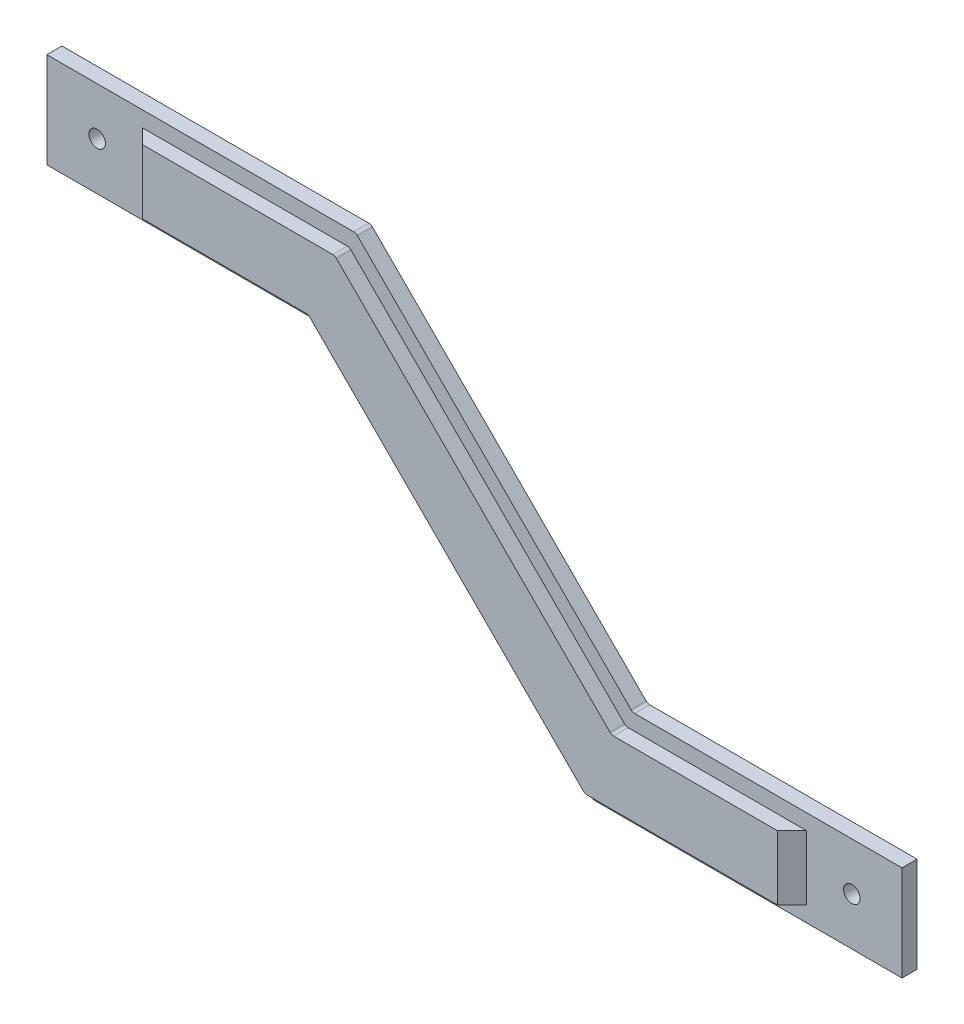
ISO-10303-21;
HEADER;
FILE_DESCRIPTION(('STEP AP214'),'2;1');
FILE_NAME('part.step','',(''),(''),'','','');
FILE_SCHEMA(('AUTOMOTIVE_DESIGN { 1 0 10303 214 1 1 1 1 }'));
ENDSEC;
DATA;
#1=APPLICATION_CONTEXT('core data for automotive mechanical design processes');
#2=APPLICATION_PROTOCOL_DEFINITION('international standard','automotive_design',2000,#1);
#3=PRODUCT_CONTEXT('',#1,'mechanical');
#4=PRODUCT('Part','Part','',(#3));
#5=PRODUCT_RELATED_PRODUCT_CATEGORY('part','',(#4));
#6=PRODUCT_DEFINITION_FORMATION('','',#4);
#7=PRODUCT_DEFINITION_CONTEXT('part definition',#1,'design');
#8=PRODUCT_DEFINITION('design','',#6,#7);
#9=PRODUCT_DEFINITION_SHAPE('','',#8);
#10=(LENGTH_UNIT() NAMED_UNIT(*) SI_UNIT(.MILLI.,.METRE.));
#11=(NAMED_UNIT(*) PLANE_ANGLE_UNIT() SI_UNIT($,.RADIAN.));
#12=(NAMED_UNIT(*) SI_UNIT($,.STERADIAN.) SOLID_ANGLE_UNIT());
#13=UNCERTAINTY_MEASURE_WITH_UNIT(LENGTH_MEASURE(1.E-05),#10,'distance_accuracy_value','');
#14=(GEOMETRIC_REPRESENTATION_CONTEXT(3) GLOBAL_UNCERTAINTY_ASSIGNED_CONTEXT((#13)) GLOBAL_UNIT_ASSIGNED_CONTEXT((#10,
#11,#12)) REPRESENTATION_CONTEXT('',''));
#15=CARTESIAN_POINT('',(0.,0.,0.));
#16=DIRECTION('',(0.,0.,1.));
#17=DIRECTION('',(1.,0.,0.));
#18=AXIS2_PLACEMENT_3D('',#15,#16,#17);
#19=CARTESIAN_POINT('',(0.,0.,3.));
#20=DIRECTION('',(0.,0.,-1.));
#21=DIRECTION('',(-1.,0.,0.));
#22=AXIS2_PLACEMENT_3D('',#19,#20,#21);
#23=PLANE('',#22);
#24=CARTESIAN_POINT('',(75.15,-27.55,3.));
#25=DIRECTION('',(0.,0.,1.));
#26=DIRECTION('',(1.,0.,0.));
#27=AXIS2_PLACEMENT_3D('',#24,#25,#26);
#28=CIRCLE('',#27,1.65);
#29=CARTESIAN_POINT('',(76.8,-27.55,3.));
#30=VERTEX_POINT('',#29);
#31=EDGE_CURVE('E381',#30,#30,#28,.T.);
#32=ORIENTED_EDGE('',*,*,#31,.F.);
#33=EDGE_LOOP('',(#32));
#34=FACE_BOUND('',#33,.T.);
#35=CARTESIAN_POINT('',(-75.15,27.55,3.));
#36=DIRECTION('',(0.,0.,1.));
#37=DIRECTION('',(1.,0.,0.));
#38=AXIS2_PLACEMENT_3D('',#35,#36,#37);
#39=CIRCLE('',#38,1.65);
#40=CARTESIAN_POINT('',(-73.5,27.55,3.));
#41=VERTEX_POINT('',#40);
#42=EDGE_CURVE('E333',#41,#41,#39,.T.);
#43=ORIENTED_EDGE('',*,*,#42,.F.);
#44=EDGE_LOOP('',(#43));
#45=FACE_BOUND('',#44,.T.);
#46=DIRECTION('',(-0.707106781186546,0.707106781186549,0.));
#47=VECTOR('',#46,1.);
#48=CARTESIAN_POINT('',(-23.6149711574555,37.05,3.));
#49=LINE('',#48,#47);
#50=CARTESIAN_POINT('',(31.1921356237317,-17.7571067811874,3.));
#51=VERTEX_POINT('',#50);
#52=CARTESIAN_POINT('',(-23.322077938642,36.7571067811865,3.));
#53=VERTEX_POINT('',#52);
#54=EDGE_CURVE('E370',#51,#53,#49,.T.);
#55=ORIENTED_EDGE('',*,*,#54,.T.);
#56=CARTESIAN_POINT('',(-24.0291847198286,36.05,3.));
#57=DIRECTION('',(0.,0.,-1.));
#58=DIRECTION('',(-1.,0.,0.));
#59=AXIS2_PLACEMENT_3D('',#56,#57,#58);
#60=CIRCLE('',#59,1.);
#61=CARTESIAN_POINT('',(-24.0291847198286,37.05,3.));
#62=VERTEX_POINT('',#61);
#63=EDGE_CURVE('E276',#53,#62,#60,.F.);
#64=ORIENTED_EDGE('',*,*,#63,.T.);
#65=DIRECTION('',(-1.,0.,0.));
#66=VECTOR('',#65,1.);
#67=CARTESIAN_POINT('',(-85.15,37.05,3.));
#68=LINE('',#67,#66);
#69=CARTESIAN_POINT('',(-85.15,37.05,3.));
#70=VERTEX_POINT('',#69);
#71=EDGE_CURVE('E215',#62,#70,#68,.T.);
#72=ORIENTED_EDGE('',*,*,#71,.T.);
#73=DIRECTION('',(0.,-1.,0.));
#74=VECTOR('',#73,1.);
#75=CARTESIAN_POINT('',(-85.15,18.05,3.));
#76=LINE('',#75,#74);
#77=CARTESIAN_POINT('',(-85.15,18.05,3.));
#78=VERTEX_POINT('',#77);
#79=EDGE_CURVE('E210',#70,#78,#76,.T.);
#80=ORIENTED_EDGE('',*,*,#79,.T.);
#81=DIRECTION('',(1.,0.,0.));
#82=VECTOR('',#81,1.);
#83=CARTESIAN_POINT('',(-31.4850288425443,18.05,3.));
#84=LINE('',#83,#82);
#85=CARTESIAN_POINT('',(-31.8992424049174,18.05,3.));
#86=VERTEX_POINT('',#85);
#87=EDGE_CURVE('E198',#78,#86,#84,.T.);
#88=ORIENTED_EDGE('',*,*,#87,.T.);
#89=CARTESIAN_POINT('',(-31.8992424049174,17.05,3.));
#90=DIRECTION('',(0.,0.,-1.));
#91=DIRECTION('',(-1.,0.,0.));
#92=AXIS2_PLACEMENT_3D('',#89,#90,#91);
#93=CIRCLE('',#92,1.);
#94=CARTESIAN_POINT('',(-31.1921356237309,17.7571067811866,3.));
#95=VERTEX_POINT('',#94);
#96=EDGE_CURVE('E46',#86,#95,#93,.T.);
#97=ORIENTED_EDGE('',*,*,#96,.T.);
#98=DIRECTION('',(0.707106781186547,-0.707106781186549,0.));
#99=VECTOR('',#98,1.);
#100=CARTESIAN_POINT('',(23.6149711574555,-37.05,3.));
#101=LINE('',#100,#99);
#102=CARTESIAN_POINT('',(23.3220779386421,-36.7571067811866,3.));
#103=VERTEX_POINT('',#102);
#104=EDGE_CURVE('E209',#95,#103,#101,.T.);
#105=ORIENTED_EDGE('',*,*,#104,.T.);
#106=CARTESIAN_POINT('',(24.0291847198286,-36.05,3.));
#107=DIRECTION('',(0.,0.,-1.));
#108=DIRECTION('',(-1.,0.,0.));
#109=AXIS2_PLACEMENT_3D('',#106,#107,#108);
#110=CIRCLE('',#109,1.);
#111=CARTESIAN_POINT('',(24.0291847198286,-37.05,3.));
#112=VERTEX_POINT('',#111);
#113=EDGE_CURVE('E272',#103,#112,#110,.F.);
#114=ORIENTED_EDGE('',*,*,#113,.T.);
#115=DIRECTION('',(1.,0.,0.));
#116=VECTOR('',#115,1.);
#117=CARTESIAN_POINT('',(85.15,-37.05,3.));
#118=LINE('',#117,#116);
#119=CARTESIAN_POINT('',(85.15,-37.05,3.));
#120=VERTEX_POINT('',#119);
#121=EDGE_CURVE('E321',#112,#120,#118,.T.);
#122=ORIENTED_EDGE('',*,*,#121,.T.);
#123=DIRECTION('',(0.,1.,0.));
#124=VECTOR('',#123,1.);
#125=CARTESIAN_POINT('',(85.15,-18.05,3.));
#126=LINE('',#125,#124);
#127=CARTESIAN_POINT('',(85.15,-18.05,3.));
#128=VERTEX_POINT('',#127);
#129=EDGE_CURVE('E373',#120,#128,#126,.T.);
#130=ORIENTED_EDGE('',*,*,#129,.T.);
#131=DIRECTION('',(-1.,0.,0.));
#132=VECTOR('',#131,1.);
#133=CARTESIAN_POINT('',(31.4850288425451,-18.0500000000008,3.));
#134=LINE('',#133,#132);
#135=CARTESIAN_POINT('',(31.8992424049182,-18.0500000000008,3.));
#136=VERTEX_POINT('',#135);
#137=EDGE_CURVE('E356',#128,#136,#134,.T.);
#138=ORIENTED_EDGE('',*,*,#137,.T.);
#139=CARTESIAN_POINT('',(31.8992424049182,-17.0500000000008,3.));
#140=DIRECTION('',(0.,0.,-1.));
#141=DIRECTION('',(-1.,0.,0.));
#142=AXIS2_PLACEMENT_3D('',#139,#140,#141);
#143=CIRCLE('',#142,1.);
#144=EDGE_CURVE('E305',#136,#51,#143,.T.);
#145=ORIENTED_EDGE('',*,*,#144,.T.);
#146=EDGE_LOOP('',(#55,#64,#72,#80,#88,#97,#105,#114,#122,#130,#138,#145));
#147=FACE_BOUND('',#146,.T.);
#148=DIRECTION('',(-0.707106781186548,0.707106781186548,0.));
#149=VECTOR('',#148,1.);
#150=CARTESIAN_POINT('',(30.2009667991878,-21.15,3.));
#151=LINE('',#150,#149);
#152=CARTESIAN_POINT('',(29.9080735803744,-20.8571067811866,3.));
#153=VERTEX_POINT('',#152);
#154=CARTESIAN_POINT('',(-24.6061399819987,33.6571067811865,3.));
#155=VERTEX_POINT('',#154);
#156=EDGE_CURVE('E390',#153,#155,#151,.T.);
#157=ORIENTED_EDGE('',*,*,#156,.F.);
#158=CARTESIAN_POINT('',(30.6151803615609,-20.15,3.));
#159=DIRECTION('',(0.,0.,-1.));
#160=DIRECTION('',(-1.,0.,0.));
#161=AXIS2_PLACEMENT_3D('',#158,#159,#160);
#162=CIRCLE('',#161,1.);
#163=CARTESIAN_POINT('',(30.6151803615609,-21.15,3.));
#164=VERTEX_POINT('',#163);
#165=EDGE_CURVE('E274',#153,#164,#162,.F.);
#166=ORIENTED_EDGE('',*,*,#165,.T.);
#167=DIRECTION('',(-1.,0.,0.));
#168=VECTOR('',#167,1.);
#169=CARTESIAN_POINT('',(66.15,-21.15,3.));
#170=LINE('',#169,#168);
#171=CARTESIAN_POINT('',(66.15,-21.15,3.));
#172=VERTEX_POINT('',#171);
#173=EDGE_CURVE('E394',#172,#164,#170,.T.);
#174=ORIENTED_EDGE('',*,*,#173,.F.);
#175=DIRECTION('',(0.,1.,0.));
#176=VECTOR('',#175,1.);
#177=CARTESIAN_POINT('',(66.15,-33.95,3.));
#178=LINE('',#177,#176);
#179=CARTESIAN_POINT('',(66.15,-33.95,3.));
#180=VERTEX_POINT('',#179);
#181=EDGE_CURVE('E397',#180,#172,#178,.T.);
#182=ORIENTED_EDGE('',*,*,#181,.F.);
#183=DIRECTION('',(1.,0.,0.));
#184=VECTOR('',#183,1.);
#185=CARTESIAN_POINT('',(24.8990332008122,-33.95,3.));
#186=LINE('',#185,#184);
#187=CARTESIAN_POINT('',(25.3132467631853,-33.95,3.));
#188=VERTEX_POINT('',#187);
#189=EDGE_CURVE('E400',#188,#180,#186,.T.);
#190=ORIENTED_EDGE('',*,*,#189,.F.);
#191=CARTESIAN_POINT('',(25.3132467631853,-32.95,3.));
#192=DIRECTION('',(0.,0.,-1.));
#193=DIRECTION('',(-1.,0.,0.));
#194=AXIS2_PLACEMENT_3D('',#191,#192,#193);
#195=CIRCLE('',#194,1.);
#196=CARTESIAN_POINT('',(24.6061399819988,-33.6571067811866,3.));
#197=VERTEX_POINT('',#196);
#198=EDGE_CURVE('E59',#188,#197,#195,.T.);
#199=ORIENTED_EDGE('',*,*,#198,.T.);
#200=DIRECTION('',(0.707106781186548,-0.707106781186547,0.));
#201=VECTOR('',#200,1.);
#202=CARTESIAN_POINT('',(-30.2009667991878,21.15,3.));
#203=LINE('',#202,#201);
#204=CARTESIAN_POINT('',(-29.9080735803744,20.8571067811865,3.));
#205=VERTEX_POINT('',#204);
#206=EDGE_CURVE('E402',#205,#197,#203,.T.);
#207=ORIENTED_EDGE('',*,*,#206,.F.);
#208=CARTESIAN_POINT('',(-30.6151803615609,20.15,3.));
#209=DIRECTION('',(0.,0.,-1.));
#210=DIRECTION('',(-1.,0.,0.));
#211=AXIS2_PLACEMENT_3D('',#208,#209,#210);
#212=CIRCLE('',#211,1.);
#213=CARTESIAN_POINT('',(-30.6151803615609,21.15,3.));
#214=VERTEX_POINT('',#213);
#215=EDGE_CURVE('E53',#205,#214,#212,.F.);
#216=ORIENTED_EDGE('',*,*,#215,.T.);
#217=DIRECTION('',(1.,0.,0.));
#218=VECTOR('',#217,1.);
#219=CARTESIAN_POINT('',(-66.15,21.15,3.));
#220=LINE('',#219,#218);
#221=CARTESIAN_POINT('',(-66.15,21.15,3.));
#222=VERTEX_POINT('',#221);
#223=EDGE_CURVE('E404',#222,#214,#220,.T.);
#224=ORIENTED_EDGE('',*,*,#223,.F.);
#225=DIRECTION('',(0.,-1.,0.));
#226=VECTOR('',#225,1.);
#227=CARTESIAN_POINT('',(-66.15,33.95,3.));
#228=LINE('',#227,#226);
#229=CARTESIAN_POINT('',(-66.15,33.95,3.));
#230=VERTEX_POINT('',#229);
#231=EDGE_CURVE('E406',#230,#222,#228,.T.);
#232=ORIENTED_EDGE('',*,*,#231,.F.);
#233=DIRECTION('',(-1.,0.,0.));
#234=VECTOR('',#233,1.);
#235=CARTESIAN_POINT('',(-24.8990332008122,33.95,3.));
#236=LINE('',#235,#234);
#237=CARTESIAN_POINT('',(-25.3132467631853,33.95,3.));
#238=VERTEX_POINT('',#237);
#239=EDGE_CURVE('E409',#238,#230,#236,.T.);
#240=ORIENTED_EDGE('',*,*,#239,.F.);
#241=CARTESIAN_POINT('',(-25.3132467631853,32.95,3.));
#242=DIRECTION('',(0.,0.,-1.));
#243=DIRECTION('',(-1.,0.,0.));
#244=AXIS2_PLACEMENT_3D('',#241,#242,#243);
#245=CIRCLE('',#244,1.);
#246=EDGE_CURVE('E301',#238,#155,#245,.T.);
#247=ORIENTED_EDGE('',*,*,#246,.T.);
#248=EDGE_LOOP('',(#157,#166,#174,#182,#190,#199,#207,#216,#224,#232,#240,#247));
#249=FACE_BOUND('',#248,.T.);
#250=ADVANCED_FACE('F38',(#34,#45,#147,#249),#23,.F.);
#251=CARTESIAN_POINT('',(0.,0.,0.));
#252=DIRECTION('',(0.,0.,-1.));
#253=DIRECTION('',(-1.,0.,0.));
#254=AXIS2_PLACEMENT_3D('',#251,#252,#253);
#255=PLANE('',#254);
#256=CARTESIAN_POINT('',(-75.15,27.55,0.));
#257=DIRECTION('',(0.,0.,1.));
#258=DIRECTION('',(1.,0.,0.));
#259=AXIS2_PLACEMENT_3D('',#256,#257,#258);
#260=CIRCLE('',#259,1.65);
#261=CARTESIAN_POINT('',(-73.5,27.55,0.));
#262=VERTEX_POINT('',#261);
#263=EDGE_CURVE('E378',#262,#262,#260,.T.);
#264=ORIENTED_EDGE('',*,*,#263,.T.);
#265=EDGE_LOOP('',(#264));
#266=FACE_BOUND('',#265,.T.);
#267=DIRECTION('',(-1.,0.,0.));
#268=VECTOR('',#267,1.);
#269=CARTESIAN_POINT('',(-85.15,37.05,0.));
#270=LINE('',#269,#268);
#271=CARTESIAN_POINT('',(-24.0291847198286,37.05,0.));
#272=VERTEX_POINT('',#271);
#273=CARTESIAN_POINT('',(-85.15,37.05,0.));
#274=VERTEX_POINT('',#273);
#275=EDGE_CURVE('E219',#272,#274,#270,.T.);
#276=ORIENTED_EDGE('',*,*,#275,.F.);
#277=CARTESIAN_POINT('',(-24.0291847198286,36.05,0.));
#278=DIRECTION('',(0.,0.,-1.));
#279=DIRECTION('',(-1.,0.,0.));
#280=AXIS2_PLACEMENT_3D('',#277,#278,#279);
#281=CIRCLE('',#280,1.);
#282=CARTESIAN_POINT('',(-23.322077938642,36.7571067811865,0.));
#283=VERTEX_POINT('',#282);
#284=EDGE_CURVE('E264',#272,#283,#281,.T.);
#285=ORIENTED_EDGE('',*,*,#284,.T.);
#286=DIRECTION('',(-0.707106781186546,0.707106781186549,0.));
#287=VECTOR('',#286,1.);
#288=CARTESIAN_POINT('',(-23.6149711574555,37.05,0.));
#289=LINE('',#288,#287);
#290=CARTESIAN_POINT('',(31.1921356237317,-17.7571067811874,0.));
#291=VERTEX_POINT('',#290);
#292=EDGE_CURVE('E343',#291,#283,#289,.T.);
#293=ORIENTED_EDGE('',*,*,#292,.F.);
#294=CARTESIAN_POINT('',(31.8992424049182,-17.0500000000008,0.));
#295=DIRECTION('',(0.,0.,-1.));
#296=DIRECTION('',(-1.,0.,0.));
#297=AXIS2_PLACEMENT_3D('',#294,#295,#296);
#298=CIRCLE('',#297,1.);
#299=CARTESIAN_POINT('',(31.8992424049182,-18.0500000000008,0.));
#300=VERTEX_POINT('',#299);
#301=EDGE_CURVE('E303',#291,#300,#298,.F.);
#302=ORIENTED_EDGE('',*,*,#301,.T.);
#303=DIRECTION('',(-1.,0.,0.));
#304=VECTOR('',#303,1.);
#305=CARTESIAN_POINT('',(31.4850288425451,-18.0500000000008,0.));
#306=LINE('',#305,#304);
#307=CARTESIAN_POINT('',(85.15,-18.05,0.));
#308=VERTEX_POINT('',#307);
#309=EDGE_CURVE('E340',#308,#300,#306,.T.);
#310=ORIENTED_EDGE('',*,*,#309,.F.);
#311=DIRECTION('',(0.,1.,0.));
#312=VECTOR('',#311,1.);
#313=CARTESIAN_POINT('',(85.15,-18.05,0.));
#314=LINE('',#313,#312);
#315=CARTESIAN_POINT('',(85.15,-37.05,0.));
#316=VERTEX_POINT('',#315);
#317=EDGE_CURVE('E338',#316,#308,#314,.T.);
#318=ORIENTED_EDGE('',*,*,#317,.F.);
#319=DIRECTION('',(1.,0.,0.));
#320=VECTOR('',#319,1.);
#321=CARTESIAN_POINT('',(85.15,-37.05,0.));
#322=LINE('',#321,#320);
#323=CARTESIAN_POINT('',(24.0291847198286,-37.05,0.));
#324=VERTEX_POINT('',#323);
#325=EDGE_CURVE('E331',#324,#316,#322,.T.);
#326=ORIENTED_EDGE('',*,*,#325,.F.);
#327=CARTESIAN_POINT('',(24.0291847198286,-36.05,0.));
#328=DIRECTION('',(0.,0.,-1.));
#329=DIRECTION('',(-1.,0.,0.));
#330=AXIS2_PLACEMENT_3D('',#327,#328,#329);
#331=CIRCLE('',#330,1.);
#332=CARTESIAN_POINT('',(23.3220779386421,-36.7571067811866,0.));
#333=VERTEX_POINT('',#332);
#334=EDGE_CURVE('E262',#324,#333,#331,.T.);
#335=ORIENTED_EDGE('',*,*,#334,.T.);
#336=DIRECTION('',(0.707106781186547,-0.707106781186549,0.));
#337=VECTOR('',#336,1.);
#338=CARTESIAN_POINT('',(23.6149711574555,-37.05,0.));
#339=LINE('',#338,#337);
#340=CARTESIAN_POINT('',(-31.1921356237309,17.7571067811866,0.));
#341=VERTEX_POINT('',#340);
#342=EDGE_CURVE('E329',#341,#333,#339,.T.);
#343=ORIENTED_EDGE('',*,*,#342,.F.);
#344=CARTESIAN_POINT('',(-31.8992424049174,17.05,0.));
#345=DIRECTION('',(0.,0.,-1.));
#346=DIRECTION('',(-1.,0.,0.));
#347=AXIS2_PLACEMENT_3D('',#344,#345,#346);
#348=CIRCLE('',#347,1.);
#349=CARTESIAN_POINT('',(-31.8992424049174,18.05,0.));
#350=VERTEX_POINT('',#349);
#351=EDGE_CURVE('E310',#341,#350,#348,.F.);
#352=ORIENTED_EDGE('',*,*,#351,.T.);
#353=DIRECTION('',(1.,0.,0.));
#354=VECTOR('',#353,1.);
#355=CARTESIAN_POINT('',(-31.4850288425443,18.05,0.));
#356=LINE('',#355,#354);
#357=CARTESIAN_POINT('',(-85.15,18.05,0.));
#358=VERTEX_POINT('',#357);
#359=EDGE_CURVE('E328',#358,#350,#356,.T.);
#360=ORIENTED_EDGE('',*,*,#359,.F.);
#361=DIRECTION('',(0.,-1.,0.));
#362=VECTOR('',#361,1.);
#363=CARTESIAN_POINT('',(-85.15,18.05,0.));
#364=LINE('',#363,#362);
#365=EDGE_CURVE('E223',#274,#358,#364,.T.);
#366=ORIENTED_EDGE('',*,*,#365,.F.);
#367=EDGE_LOOP('',(#276,#285,#293,#302,#310,#318,#326,#335,#343,#352,#360,#366));
#368=FACE_BOUND('',#367,.T.);
#369=CARTESIAN_POINT('',(75.15,-27.55,0.));
#370=DIRECTION('',(0.,0.,1.));
#371=DIRECTION('',(1.,0.,0.));
#372=AXIS2_PLACEMENT_3D('',#369,#370,#371);
#373=CIRCLE('',#372,1.65);
#374=CARTESIAN_POINT('',(76.8,-27.55,0.));
#375=VERTEX_POINT('',#374);
#376=EDGE_CURVE('E384',#375,#375,#373,.T.);
#377=ORIENTED_EDGE('',*,*,#376,.T.);
#378=EDGE_LOOP('',(#377));
#379=FACE_BOUND('',#378,.T.);
#380=ADVANCED_FACE('F326',(#266,#368,#379),#255,.T.);
#381=CARTESIAN_POINT('',(-85.15,18.05,3.));
#382=DIRECTION('',(1.,0.,0.));
#383=DIRECTION('',(0.,0.,-1.));
#384=AXIS2_PLACEMENT_3D('',#381,#382,#383);
#385=PLANE('',#384);
#386=ORIENTED_EDGE('',*,*,#365,.T.);
#387=DIRECTION('',(0.,0.,-1.));
#388=VECTOR('',#387,1.);
#389=CARTESIAN_POINT('',(-85.15,18.05,3.));
#390=LINE('',#389,#388);
#391=EDGE_CURVE('E203',#78,#358,#390,.T.);
#392=ORIENTED_EDGE('',*,*,#391,.F.);
#393=ORIENTED_EDGE('',*,*,#79,.F.);
#394=DIRECTION('',(0.,0.,-1.));
#395=VECTOR('',#394,1.);
#396=CARTESIAN_POINT('',(-85.15,37.05,3.));
#397=LINE('',#396,#395);
#398=EDGE_CURVE('E347',#70,#274,#397,.T.);
#399=ORIENTED_EDGE('',*,*,#398,.T.);
#400=EDGE_LOOP('',(#386,#392,#393,#399));
#401=FACE_BOUND('',#400,.T.);
#402=ADVANCED_FACE('F221',(#401),#385,.F.);
#403=CARTESIAN_POINT('',(-31.4850288425443,18.05,3.));
#404=DIRECTION('',(0.,1.,0.));
#405=DIRECTION('',(-1.,0.,0.));
#406=AXIS2_PLACEMENT_3D('',#403,#404,#405);
#407=PLANE('',#406);
#408=ORIENTED_EDGE('',*,*,#359,.T.);
#409=DIRECTION('',(0.,0.,-1.));
#410=VECTOR('',#409,1.);
#411=CARTESIAN_POINT('',(-31.8992424049174,18.05,3.));
#412=LINE('',#411,#410);
#413=EDGE_CURVE('E206',#350,#86,#412,.F.);
#414=ORIENTED_EDGE('',*,*,#413,.T.);
#415=ORIENTED_EDGE('',*,*,#87,.F.);
#416=ORIENTED_EDGE('',*,*,#391,.T.);
#417=EDGE_LOOP('',(#408,#414,#415,#416));
#418=FACE_BOUND('',#417,.T.);
#419=ADVANCED_FACE('F201',(#418),#407,.F.);
#420=CARTESIAN_POINT('',(23.6149711574555,-37.05,3.));
#421=DIRECTION('',(0.707106781186548,0.707106781186546,0.));
#422=DIRECTION('',(-0.707106781186547,0.707106781186549,0.));
#423=AXIS2_PLACEMENT_3D('',#420,#421,#422);
#424=PLANE('',#423);
#425=ORIENTED_EDGE('',*,*,#342,.T.);
#426=DIRECTION('',(0.,0.,-1.));
#427=VECTOR('',#426,1.);
#428=CARTESIAN_POINT('',(23.3220779386421,-36.7571067811866,3.));
#429=LINE('',#428,#427);
#430=EDGE_CURVE('E288',#333,#103,#429,.F.);
#431=ORIENTED_EDGE('',*,*,#430,.T.);
#432=ORIENTED_EDGE('',*,*,#104,.F.);
#433=DIRECTION('',(0.,0.,-1.));
#434=VECTOR('',#433,1.);
#435=CARTESIAN_POINT('',(-31.1921356237309,17.7571067811866,0.));
#436=LINE('',#435,#434);
#437=EDGE_CURVE('E285',#95,#341,#436,.T.);
#438=ORIENTED_EDGE('',*,*,#437,.T.);
#439=EDGE_LOOP('',(#425,#431,#432,#438));
#440=FACE_BOUND('',#439,.T.);
#441=ADVANCED_FACE('F318',(#440),#424,.F.);
#442=CARTESIAN_POINT('',(85.15,-37.05,3.));
#443=DIRECTION('',(0.,1.,0.));
#444=DIRECTION('',(-1.,0.,0.));
#445=AXIS2_PLACEMENT_3D('',#442,#443,#444);
#446=PLANE('',#445);
#447=ORIENTED_EDGE('',*,*,#121,.F.);
#448=DIRECTION('',(0.,0.,-1.));
#449=VECTOR('',#448,1.);
#450=CARTESIAN_POINT('',(24.0291847198286,-37.05,3.));
#451=LINE('',#450,#449);
#452=EDGE_CURVE('E282',#112,#324,#451,.T.);
#453=ORIENTED_EDGE('',*,*,#452,.T.);
#454=ORIENTED_EDGE('',*,*,#325,.T.);
#455=DIRECTION('',(0.,0.,-1.));
#456=VECTOR('',#455,1.);
#457=CARTESIAN_POINT('',(85.15,-37.05,3.));
#458=LINE('',#457,#456);
#459=EDGE_CURVE('E225',#120,#316,#458,.T.);
#460=ORIENTED_EDGE('',*,*,#459,.F.);
#461=EDGE_LOOP('',(#447,#453,#454,#460));
#462=FACE_BOUND('',#461,.T.);
#463=ADVANCED_FACE('F485',(#462),#446,.F.);
#464=CARTESIAN_POINT('',(85.15,-18.05,3.));
#465=DIRECTION('',(-1.,0.,0.));
#466=DIRECTION('',(0.,0.,1.));
#467=AXIS2_PLACEMENT_3D('',#464,#465,#466);
#468=PLANE('',#467);
#469=ORIENTED_EDGE('',*,*,#317,.T.);
#470=DIRECTION('',(0.,0.,-1.));
#471=VECTOR('',#470,1.);
#472=CARTESIAN_POINT('',(85.15,-18.05,3.));
#473=LINE('',#472,#471);
#474=EDGE_CURVE('E231',#128,#308,#473,.T.);
#475=ORIENTED_EDGE('',*,*,#474,.F.);
#476=ORIENTED_EDGE('',*,*,#129,.F.);
#477=ORIENTED_EDGE('',*,*,#459,.T.);
#478=EDGE_LOOP('',(#469,#475,#476,#477));
#479=FACE_BOUND('',#478,.T.);
#480=ADVANCED_FACE('F482',(#479),#468,.F.);
#481=CARTESIAN_POINT('',(31.4850288425451,-18.0500000000008,3.));
#482=DIRECTION('',(0.,-1.,0.));
#483=DIRECTION('',(1.,0.,0.));
#484=AXIS2_PLACEMENT_3D('',#481,#482,#483);
#485=PLANE('',#484);
#486=ORIENTED_EDGE('',*,*,#309,.T.);
#487=DIRECTION('',(0.,0.,-1.));
#488=VECTOR('',#487,1.);
#489=CARTESIAN_POINT('',(31.8992424049182,-18.0500000000008,3.));
#490=LINE('',#489,#488);
#491=EDGE_CURVE('E278',#300,#136,#490,.F.);
#492=ORIENTED_EDGE('',*,*,#491,.T.);
#493=ORIENTED_EDGE('',*,*,#137,.F.);
#494=ORIENTED_EDGE('',*,*,#474,.T.);
#495=EDGE_LOOP('',(#486,#492,#493,#494));
#496=FACE_BOUND('',#495,.T.);
#497=ADVANCED_FACE('F353',(#496),#485,.F.);
#498=CARTESIAN_POINT('',(-23.6149711574555,37.05,3.));
#499=DIRECTION('',(-0.707106781186549,-0.707106781186546,0.));
#500=DIRECTION('',(0.707106781186546,-0.707106781186549,0.));
#501=AXIS2_PLACEMENT_3D('',#498,#499,#500);
#502=PLANE('',#501);
#503=ORIENTED_EDGE('',*,*,#292,.T.);
#504=DIRECTION('',(0.,0.,-1.));
#505=VECTOR('',#504,1.);
#506=CARTESIAN_POINT('',(-23.322077938642,36.7571067811865,3.));
#507=LINE('',#506,#505);
#508=EDGE_CURVE('E269',#283,#53,#507,.F.);
#509=ORIENTED_EDGE('',*,*,#508,.T.);
#510=ORIENTED_EDGE('',*,*,#54,.F.);
#511=DIRECTION('',(0.,0.,-1.));
#512=VECTOR('',#511,1.);
#513=CARTESIAN_POINT('',(31.1921356237317,-17.7571067811874,0.));
#514=LINE('',#513,#512);
#515=EDGE_CURVE('E266',#51,#291,#514,.T.);
#516=ORIENTED_EDGE('',*,*,#515,.T.);
#517=EDGE_LOOP('',(#503,#509,#510,#516));
#518=FACE_BOUND('',#517,.T.);
#519=ADVANCED_FACE('F368',(#518),#502,.F.);
#520=CARTESIAN_POINT('',(-85.15,37.05,3.));
#521=DIRECTION('',(0.,-1.,0.));
#522=DIRECTION('',(0.,0.,-1.));
#523=AXIS2_PLACEMENT_3D('',#520,#521,#522);
#524=PLANE('',#523);
#525=ORIENTED_EDGE('',*,*,#71,.F.);
#526=DIRECTION('',(0.,0.,-1.));
#527=VECTOR('',#526,1.);
#528=CARTESIAN_POINT('',(-24.0291847198286,37.05,3.));
#529=LINE('',#528,#527);
#530=EDGE_CURVE('E259',#62,#272,#529,.T.);
#531=ORIENTED_EDGE('',*,*,#530,.T.);
#532=ORIENTED_EDGE('',*,*,#275,.T.);
#533=ORIENTED_EDGE('',*,*,#398,.F.);
#534=EDGE_LOOP('',(#525,#531,#532,#533));
#535=FACE_BOUND('',#534,.T.);
#536=ADVANCED_FACE('F474',(#535),#524,.F.);
#537=CARTESIAN_POINT('',(-75.15,27.55,3.));
#538=DIRECTION('',(0.,0.,-1.));
#539=DIRECTION('',(-1.,0.,0.));
#540=AXIS2_PLACEMENT_3D('',#537,#538,#539);
#541=CYLINDRICAL_SURFACE('',#540,1.65);
#542=ORIENTED_EDGE('',*,*,#42,.T.);
#543=EDGE_LOOP('',(#542));
#544=FACE_BOUND('',#543,.T.);
#545=ORIENTED_EDGE('',*,*,#263,.F.);
#546=EDGE_LOOP('',(#545));
#547=FACE_BOUND('',#546,.T.);
#548=ADVANCED_FACE('F471',(#544,#547),#541,.F.);
#549=CARTESIAN_POINT('',(75.15,-27.55,3.));
#550=DIRECTION('',(0.,0.,-1.));
#551=DIRECTION('',(-1.,0.,0.));
#552=AXIS2_PLACEMENT_3D('',#549,#550,#551);
#553=CYLINDRICAL_SURFACE('',#552,1.65);
#554=ORIENTED_EDGE('',*,*,#31,.T.);
#555=EDGE_LOOP('',(#554));
#556=FACE_BOUND('',#555,.T.);
#557=ORIENTED_EDGE('',*,*,#376,.F.);
#558=EDGE_LOOP('',(#557));
#559=FACE_BOUND('',#558,.T.);
#560=ADVANCED_FACE('F646',(#556,#559),#553,.F.);
#561=CARTESIAN_POINT('',(-24.8990332008122,33.95,5.9));
#562=DIRECTION('',(0.,-1.,0.));
#563=DIRECTION('',(1.,0.,0.));
#564=AXIS2_PLACEMENT_3D('',#561,#562,#563);
#565=PLANE('',#564);
#566=DIRECTION('',(-1.,0.,0.));
#567=VECTOR('',#566,1.);
#568=CARTESIAN_POINT('',(-24.8990332008122,33.95,5.9));
#569=LINE('',#568,#567);
#570=CARTESIAN_POINT('',(-25.3132467631853,33.95,5.9));
#571=VERTEX_POINT('',#570);
#572=CARTESIAN_POINT('',(-63.25,33.95,5.9));
#573=VERTEX_POINT('',#572);
#574=EDGE_CURVE('E393',#571,#573,#569,.T.);
#575=ORIENTED_EDGE('',*,*,#574,.F.);
#576=DIRECTION('',(0.,0.,-1.));
#577=VECTOR('',#576,1.);
#578=CARTESIAN_POINT('',(-25.3132467631853,33.95,5.9));
#579=LINE('',#578,#577);
#580=EDGE_CURVE('E247',#571,#238,#579,.T.);
#581=ORIENTED_EDGE('',*,*,#580,.T.);
#582=ORIENTED_EDGE('',*,*,#239,.T.);
#583=DIRECTION('',(0.707106781186544,0.,0.707106781186551));
#584=VECTOR('',#583,1.);
#585=CARTESIAN_POINT('',(-63.25,33.95,5.9));
#586=LINE('',#585,#584);
#587=EDGE_CURVE('E244',#230,#573,#586,.T.);
#588=ORIENTED_EDGE('',*,*,#587,.T.);
#589=EDGE_LOOP('',(#575,#581,#582,#588));
#590=FACE_BOUND('',#589,.T.);
#591=ADVANCED_FACE('F433',(#590),#565,.F.);
#592=CARTESIAN_POINT('',(-66.15,21.15,5.9));
#593=DIRECTION('',(0.,1.,0.));
#594=DIRECTION('',(-1.,0.,0.));
#595=AXIS2_PLACEMENT_3D('',#592,#593,#594);
#596=PLANE('',#595);
#597=ORIENTED_EDGE('',*,*,#223,.T.);
#598=DIRECTION('',(0.,0.,-1.));
#599=VECTOR('',#598,1.);
#600=CARTESIAN_POINT('',(-30.6151803615609,21.15,5.9));
#601=LINE('',#600,#599);
#602=CARTESIAN_POINT('',(-30.6151803615609,21.15,5.9));
#603=VERTEX_POINT('',#602);
#604=EDGE_CURVE('E299',#214,#603,#601,.F.);
#605=ORIENTED_EDGE('',*,*,#604,.T.);
#606=DIRECTION('',(1.,0.,0.));
#607=VECTOR('',#606,1.);
#608=CARTESIAN_POINT('',(-66.15,21.15,5.9));
#609=LINE('',#608,#607);
#610=CARTESIAN_POINT('',(-63.25,21.15,5.9));
#611=VERTEX_POINT('',#610);
#612=EDGE_CURVE('E421',#611,#603,#609,.T.);
#613=ORIENTED_EDGE('',*,*,#612,.F.);
#614=DIRECTION('',(-0.707106781186544,0.,-0.707106781186551));
#615=VECTOR('',#614,1.);
#616=CARTESIAN_POINT('',(-63.25,21.15,5.9));
#617=LINE('',#616,#615);
#618=EDGE_CURVE('E242',#611,#222,#617,.T.);
#619=ORIENTED_EDGE('',*,*,#618,.T.);
#620=EDGE_LOOP('',(#597,#605,#613,#619));
#621=FACE_BOUND('',#620,.T.);
#622=ADVANCED_FACE('F439',(#621),#596,.F.);
#623=CARTESIAN_POINT('',(-30.2009667991878,21.15,5.9));
#624=DIRECTION('',(0.707106781186547,0.707106781186548,0.));
#625=DIRECTION('',(-0.707106781186548,0.707106781186547,0.));
#626=AXIS2_PLACEMENT_3D('',#623,#624,#625);
#627=PLANE('',#626);
#628=ORIENTED_EDGE('',*,*,#206,.T.);
#629=DIRECTION('',(0.,0.,-1.));
#630=VECTOR('',#629,1.);
#631=CARTESIAN_POINT('',(24.6061399819988,-33.6571067811866,5.9));
#632=LINE('',#631,#630);
#633=CARTESIAN_POINT('',(24.6061399819988,-33.6571067811866,5.9));
#634=VERTEX_POINT('',#633);
#635=EDGE_CURVE('E296',#197,#634,#632,.F.);
#636=ORIENTED_EDGE('',*,*,#635,.T.);
#637=DIRECTION('',(0.707106781186548,-0.707106781186547,0.));
#638=VECTOR('',#637,1.);
#639=CARTESIAN_POINT('',(-30.2009667991878,21.15,5.9));
#640=LINE('',#639,#638);
#641=CARTESIAN_POINT('',(-29.9080735803744,20.8571067811865,5.9));
#642=VERTEX_POINT('',#641);
#643=EDGE_CURVE('E418',#642,#634,#640,.T.);
#644=ORIENTED_EDGE('',*,*,#643,.F.);
#645=DIRECTION('',(0.,0.,-1.));
#646=VECTOR('',#645,1.);
#647=CARTESIAN_POINT('',(-29.9080735803744,20.8571067811865,3.));
#648=LINE('',#647,#646);
#649=EDGE_CURVE('E293',#642,#205,#648,.T.);
#650=ORIENTED_EDGE('',*,*,#649,.T.);
#651=EDGE_LOOP('',(#628,#636,#644,#650));
#652=FACE_BOUND('',#651,.T.);
#653=ADVANCED_FACE('F528',(#652),#627,.F.);
#654=CARTESIAN_POINT('',(24.8990332008122,-33.95,5.9));
#655=DIRECTION('',(0.,1.,0.));
#656=DIRECTION('',(0.,0.,1.));
#657=AXIS2_PLACEMENT_3D('',#654,#655,#656);
#658=PLANE('',#657);
#659=DIRECTION('',(1.,0.,0.));
#660=VECTOR('',#659,1.);
#661=CARTESIAN_POINT('',(24.8990332008122,-33.95,5.9));
#662=LINE('',#661,#660);
#663=CARTESIAN_POINT('',(25.3132467631853,-33.95,5.9));
#664=VERTEX_POINT('',#663);
#665=CARTESIAN_POINT('',(63.25,-33.95,5.9));
#666=VERTEX_POINT('',#665);
#667=EDGE_CURVE('E416',#664,#666,#662,.T.);
#668=ORIENTED_EDGE('',*,*,#667,.F.);
#669=DIRECTION('',(0.,0.,-1.));
#670=VECTOR('',#669,1.);
#671=CARTESIAN_POINT('',(25.3132467631853,-33.95,5.9));
#672=LINE('',#671,#670);
#673=EDGE_CURVE('E290',#664,#188,#672,.T.);
#674=ORIENTED_EDGE('',*,*,#673,.T.);
#675=ORIENTED_EDGE('',*,*,#189,.T.);
#676=DIRECTION('',(-0.707106781186544,0.,0.707106781186551));
#677=VECTOR('',#676,1.);
#678=CARTESIAN_POINT('',(63.2500000000001,-33.95,5.9));
#679=LINE('',#678,#677);
#680=EDGE_CURVE('E239',#180,#666,#679,.T.);
#681=ORIENTED_EDGE('',*,*,#680,.T.);
#682=EDGE_LOOP('',(#668,#674,#675,#681));
#683=FACE_BOUND('',#682,.T.);
#684=ADVANCED_FACE('F512',(#683),#658,.F.);
#685=CARTESIAN_POINT('',(66.15,-21.15,5.9));
#686=DIRECTION('',(0.,-1.,0.));
#687=DIRECTION('',(0.,0.,-1.));
#688=AXIS2_PLACEMENT_3D('',#685,#686,#687);
#689=PLANE('',#688);
#690=ORIENTED_EDGE('',*,*,#173,.T.);
#691=DIRECTION('',(0.,0.,-1.));
#692=VECTOR('',#691,1.);
#693=CARTESIAN_POINT('',(30.6151803615609,-21.15,5.9));
#694=LINE('',#693,#692);
#695=CARTESIAN_POINT('',(30.6151803615609,-21.15,5.9));
#696=VERTEX_POINT('',#695);
#697=EDGE_CURVE('E280',#164,#696,#694,.F.);
#698=ORIENTED_EDGE('',*,*,#697,.T.);
#699=DIRECTION('',(-1.,0.,0.));
#700=VECTOR('',#699,1.);
#701=CARTESIAN_POINT('',(66.15,-21.15,5.9));
#702=LINE('',#701,#700);
#703=CARTESIAN_POINT('',(63.2500000000001,-21.15,5.9));
#704=VERTEX_POINT('',#703);
#705=EDGE_CURVE('E413',#704,#696,#702,.T.);
#706=ORIENTED_EDGE('',*,*,#705,.F.);
#707=DIRECTION('',(0.707106781186544,0.,-0.707106781186551));
#708=VECTOR('',#707,1.);
#709=CARTESIAN_POINT('',(63.2500000000001,-21.15,5.9));
#710=LINE('',#709,#708);
#711=EDGE_CURVE('E237',#704,#172,#710,.T.);
#712=ORIENTED_EDGE('',*,*,#711,.T.);
#713=EDGE_LOOP('',(#690,#698,#706,#712));
#714=FACE_BOUND('',#713,.T.);
#715=ADVANCED_FACE('F517',(#714),#689,.F.);
#716=CARTESIAN_POINT('',(30.2009667991878,-21.15,5.9));
#717=DIRECTION('',(-0.707106781186547,-0.707106781186547,0.));
#718=DIRECTION('',(0.707106781186548,-0.707106781186548,0.));
#719=AXIS2_PLACEMENT_3D('',#716,#717,#718);
#720=PLANE('',#719);
#721=ORIENTED_EDGE('',*,*,#156,.T.);
#722=DIRECTION('',(0.,0.,-1.));
#723=VECTOR('',#722,1.);
#724=CARTESIAN_POINT('',(-24.6061399819987,33.6571067811865,5.9));
#725=LINE('',#724,#723);
#726=CARTESIAN_POINT('',(-24.6061399819987,33.6571067811865,5.9));
#727=VERTEX_POINT('',#726);
#728=EDGE_CURVE('E253',#155,#727,#725,.F.);
#729=ORIENTED_EDGE('',*,*,#728,.T.);
#730=DIRECTION('',(-0.707106781186548,0.707106781186548,0.));
#731=VECTOR('',#730,1.);
#732=CARTESIAN_POINT('',(30.2009667991878,-21.15,5.9));
#733=LINE('',#732,#731);
#734=CARTESIAN_POINT('',(29.9080735803744,-20.8571067811866,5.9));
#735=VERTEX_POINT('',#734);
#736=EDGE_CURVE('E387',#735,#727,#733,.T.);
#737=ORIENTED_EDGE('',*,*,#736,.F.);
#738=DIRECTION('',(0.,0.,-1.));
#739=VECTOR('',#738,1.);
#740=CARTESIAN_POINT('',(29.9080735803744,-20.8571067811866,3.));
#741=LINE('',#740,#739);
#742=EDGE_CURVE('E250',#735,#153,#741,.T.);
#743=ORIENTED_EDGE('',*,*,#742,.T.);
#744=EDGE_LOOP('',(#721,#729,#737,#743));
#745=FACE_BOUND('',#744,.T.);
#746=ADVANCED_FACE('F445',(#745),#720,.F.);
#747=CARTESIAN_POINT('',(0.,0.,5.9));
#748=DIRECTION('',(0.,0.,1.));
#749=DIRECTION('',(1.,0.,0.));
#750=AXIS2_PLACEMENT_3D('',#747,#748,#749);
#751=PLANE('',#750);
#752=ORIENTED_EDGE('',*,*,#736,.T.);
#753=CARTESIAN_POINT('',(-25.3132467631853,32.95,5.9));
#754=DIRECTION('',(0.,0.,1.));
#755=DIRECTION('',(1.,0.,0.));
#756=AXIS2_PLACEMENT_3D('',#753,#754,#755);
#757=CIRCLE('',#756,1.);
#758=EDGE_CURVE('E257',#727,#571,#757,.T.);
#759=ORIENTED_EDGE('',*,*,#758,.T.);
#760=ORIENTED_EDGE('',*,*,#574,.T.);
#761=DIRECTION('',(0.,-1.,0.));
#762=VECTOR('',#761,1.);
#763=CARTESIAN_POINT('',(-63.25,21.15,5.9));
#764=LINE('',#763,#762);
#765=EDGE_CURVE('E224',#573,#611,#764,.T.);
#766=ORIENTED_EDGE('',*,*,#765,.T.);
#767=ORIENTED_EDGE('',*,*,#612,.T.);
#768=CARTESIAN_POINT('',(-30.6151803615609,20.15,5.9));
#769=DIRECTION('',(0.,0.,1.));
#770=DIRECTION('',(1.,0.,0.));
#771=AXIS2_PLACEMENT_3D('',#768,#769,#770);
#772=CIRCLE('',#771,1.);
#773=EDGE_CURVE('E11',#603,#642,#772,.F.);
#774=ORIENTED_EDGE('',*,*,#773,.T.);
#775=ORIENTED_EDGE('',*,*,#643,.T.);
#776=CARTESIAN_POINT('',(25.3132467631853,-32.95,5.9));
#777=DIRECTION('',(0.,0.,1.));
#778=DIRECTION('',(1.,0.,0.));
#779=AXIS2_PLACEMENT_3D('',#776,#777,#778);
#780=CIRCLE('',#779,1.);
#781=EDGE_CURVE('E255',#634,#664,#780,.T.);
#782=ORIENTED_EDGE('',*,*,#781,.T.);
#783=ORIENTED_EDGE('',*,*,#667,.T.);
#784=DIRECTION('',(0.,1.,0.));
#785=VECTOR('',#784,1.);
#786=CARTESIAN_POINT('',(63.2500000000001,-21.15,5.9));
#787=LINE('',#786,#785);
#788=EDGE_CURVE('E228',#666,#704,#787,.T.);
#789=ORIENTED_EDGE('',*,*,#788,.T.);
#790=ORIENTED_EDGE('',*,*,#705,.T.);
#791=CARTESIAN_POINT('',(30.6151803615609,-20.15,5.9));
#792=DIRECTION('',(0.,0.,1.));
#793=DIRECTION('',(1.,0.,0.));
#794=AXIS2_PLACEMENT_3D('',#791,#792,#793);
#795=CIRCLE('',#794,1.);
#796=EDGE_CURVE('E307',#696,#735,#795,.F.);
#797=ORIENTED_EDGE('',*,*,#796,.T.);
#798=EDGE_LOOP('',(#752,#759,#760,#766,#767,#774,#775,#782,#783,#789,#790,#797));
#799=FACE_BOUND('',#798,.T.);
#800=ADVANCED_FACE('F426',(#799),#751,.T.);
#801=CARTESIAN_POINT('',(63.2500000000001,0.,5.9));
#802=DIRECTION('',(0.707106781186551,0.,0.707106781186544));
#803=DIRECTION('',(0.,-1.,0.));
#804=AXIS2_PLACEMENT_3D('',#801,#802,#803);
#805=PLANE('',#804);
#806=ORIENTED_EDGE('',*,*,#680,.F.);
#807=ORIENTED_EDGE('',*,*,#181,.T.);
#808=ORIENTED_EDGE('',*,*,#711,.F.);
#809=ORIENTED_EDGE('',*,*,#788,.F.);
#810=EDGE_LOOP('',(#806,#807,#808,#809));
#811=FACE_BOUND('',#810,.T.);
#812=ADVANCED_FACE('F458',(#811),#805,.T.);
#813=CARTESIAN_POINT('',(-63.25,0.,5.9));
#814=DIRECTION('',(-0.707106781186551,0.,0.707106781186544));
#815=DIRECTION('',(0.,1.,0.));
#816=AXIS2_PLACEMENT_3D('',#813,#814,#815);
#817=PLANE('',#816);
#818=ORIENTED_EDGE('',*,*,#587,.F.);
#819=ORIENTED_EDGE('',*,*,#231,.T.);
#820=ORIENTED_EDGE('',*,*,#618,.F.);
#821=ORIENTED_EDGE('',*,*,#765,.F.);
#822=EDGE_LOOP('',(#818,#819,#820,#821));
#823=FACE_BOUND('',#822,.T.);
#824=ADVANCED_FACE('F437',(#823),#817,.T.);
#825=CARTESIAN_POINT('',(-25.3132467631853,32.95,5.9));
#826=DIRECTION('',(0.,0.,-1.));
#827=DIRECTION('',(-1.,0.,0.));
#828=AXIS2_PLACEMENT_3D('',#825,#826,#827);
#829=CYLINDRICAL_SURFACE('',#828,1.);
#830=ORIENTED_EDGE('',*,*,#758,.F.);
#831=ORIENTED_EDGE('',*,*,#728,.F.);
#832=ORIENTED_EDGE('',*,*,#246,.F.);
#833=ORIENTED_EDGE('',*,*,#580,.F.);
#834=EDGE_LOOP('',(#830,#831,#832,#833));
#835=FACE_BOUND('',#834,.T.);
#836=ADVANCED_FACE('F448',(#835),#829,.T.);
#837=CARTESIAN_POINT('',(-24.0291847198286,36.05,3.));
#838=DIRECTION('',(0.,0.,-1.));
#839=DIRECTION('',(-1.,0.,0.));
#840=AXIS2_PLACEMENT_3D('',#837,#838,#839);
#841=CYLINDRICAL_SURFACE('',#840,1.);
#842=ORIENTED_EDGE('',*,*,#63,.F.);
#843=ORIENTED_EDGE('',*,*,#508,.F.);
#844=ORIENTED_EDGE('',*,*,#284,.F.);
#845=ORIENTED_EDGE('',*,*,#530,.F.);
#846=EDGE_LOOP('',(#842,#843,#844,#845));
#847=FACE_BOUND('',#846,.T.);
#848=ADVANCED_FACE('F450',(#847),#841,.T.);
#849=CARTESIAN_POINT('',(31.8992424049182,-17.0500000000008,3.));
#850=DIRECTION('',(0.,0.,1.));
#851=DIRECTION('',(1.,0.,0.));
#852=AXIS2_PLACEMENT_3D('',#849,#850,#851);
#853=CYLINDRICAL_SURFACE('',#852,1.);
#854=ORIENTED_EDGE('',*,*,#144,.F.);
#855=ORIENTED_EDGE('',*,*,#491,.F.);
#856=ORIENTED_EDGE('',*,*,#301,.F.);
#857=ORIENTED_EDGE('',*,*,#515,.F.);
#858=EDGE_LOOP('',(#854,#855,#856,#857));
#859=FACE_BOUND('',#858,.T.);
#860=ADVANCED_FACE('F365',(#859),#853,.F.);
#861=CARTESIAN_POINT('',(30.6151803615609,-20.15,5.9));
#862=DIRECTION('',(0.,0.,1.));
#863=DIRECTION('',(1.,0.,0.));
#864=AXIS2_PLACEMENT_3D('',#861,#862,#863);
#865=CYLINDRICAL_SURFACE('',#864,1.);
#866=ORIENTED_EDGE('',*,*,#796,.F.);
#867=ORIENTED_EDGE('',*,*,#697,.F.);
#868=ORIENTED_EDGE('',*,*,#165,.F.);
#869=ORIENTED_EDGE('',*,*,#742,.F.);
#870=EDGE_LOOP('',(#866,#867,#868,#869));
#871=FACE_BOUND('',#870,.T.);
#872=ADVANCED_FACE('F521',(#871),#865,.F.);
#873=CARTESIAN_POINT('',(24.0291847198286,-36.05,3.));
#874=DIRECTION('',(0.,0.,-1.));
#875=DIRECTION('',(-1.,0.,0.));
#876=AXIS2_PLACEMENT_3D('',#873,#874,#875);
#877=CYLINDRICAL_SURFACE('',#876,1.);
#878=ORIENTED_EDGE('',*,*,#113,.F.);
#879=ORIENTED_EDGE('',*,*,#430,.F.);
#880=ORIENTED_EDGE('',*,*,#334,.F.);
#881=ORIENTED_EDGE('',*,*,#452,.F.);
#882=EDGE_LOOP('',(#878,#879,#880,#881));
#883=FACE_BOUND('',#882,.T.);
#884=ADVANCED_FACE('F539',(#883),#877,.T.);
#885=CARTESIAN_POINT('',(25.3132467631853,-32.95,5.9));
#886=DIRECTION('',(0.,0.,-1.));
#887=DIRECTION('',(-1.,0.,0.));
#888=AXIS2_PLACEMENT_3D('',#885,#886,#887);
#889=CYLINDRICAL_SURFACE('',#888,1.);
#890=ORIENTED_EDGE('',*,*,#781,.F.);
#891=ORIENTED_EDGE('',*,*,#635,.F.);
#892=ORIENTED_EDGE('',*,*,#198,.F.);
#893=ORIENTED_EDGE('',*,*,#673,.F.);
#894=EDGE_LOOP('',(#890,#891,#892,#893));
#895=FACE_BOUND('',#894,.T.);
#896=ADVANCED_FACE('F526',(#895),#889,.T.);
#897=CARTESIAN_POINT('',(-31.8992424049174,17.05,3.));
#898=DIRECTION('',(0.,0.,1.));
#899=DIRECTION('',(1.,0.,0.));
#900=AXIS2_PLACEMENT_3D('',#897,#898,#899);
#901=CYLINDRICAL_SURFACE('',#900,1.);
#902=ORIENTED_EDGE('',*,*,#96,.F.);
#903=ORIENTED_EDGE('',*,*,#413,.F.);
#904=ORIENTED_EDGE('',*,*,#351,.F.);
#905=ORIENTED_EDGE('',*,*,#437,.F.);
#906=EDGE_LOOP('',(#902,#903,#904,#905));
#907=FACE_BOUND('',#906,.T.);
#908=ADVANCED_FACE('F323',(#907),#901,.F.);
#909=CARTESIAN_POINT('',(-30.6151803615609,20.15,5.9));
#910=DIRECTION('',(0.,0.,1.));
#911=DIRECTION('',(1.,0.,0.));
#912=AXIS2_PLACEMENT_3D('',#909,#910,#911);
#913=CYLINDRICAL_SURFACE('',#912,1.);
#914=ORIENTED_EDGE('',*,*,#773,.F.);
#915=ORIENTED_EDGE('',*,*,#604,.F.);
#916=ORIENTED_EDGE('',*,*,#215,.F.);
#917=ORIENTED_EDGE('',*,*,#649,.F.);
#918=EDGE_LOOP('',(#914,#915,#916,#917));
#919=FACE_BOUND('',#918,.T.);
#920=ADVANCED_FACE('F40',(#919),#913,.F.);
#921=CLOSED_SHELL('',(#250,#380,#402,#419,#441,#463,#480,#497,#519,#536,#548,#560,#591,#622,
#653,#684,#715,#746,#800,#812,#824,#836,#848,#860,#872,#884,#896,#908,#920));
#922=MANIFOLD_SOLID_BREP('B2',#921);
#923=ADVANCED_BREP_SHAPE_REPRESENTATION('',(#18,#922),#14);
#924=SHAPE_DEFINITION_REPRESENTATION(#9,#923);
ENDSEC;
END-ISO-10303-21;
